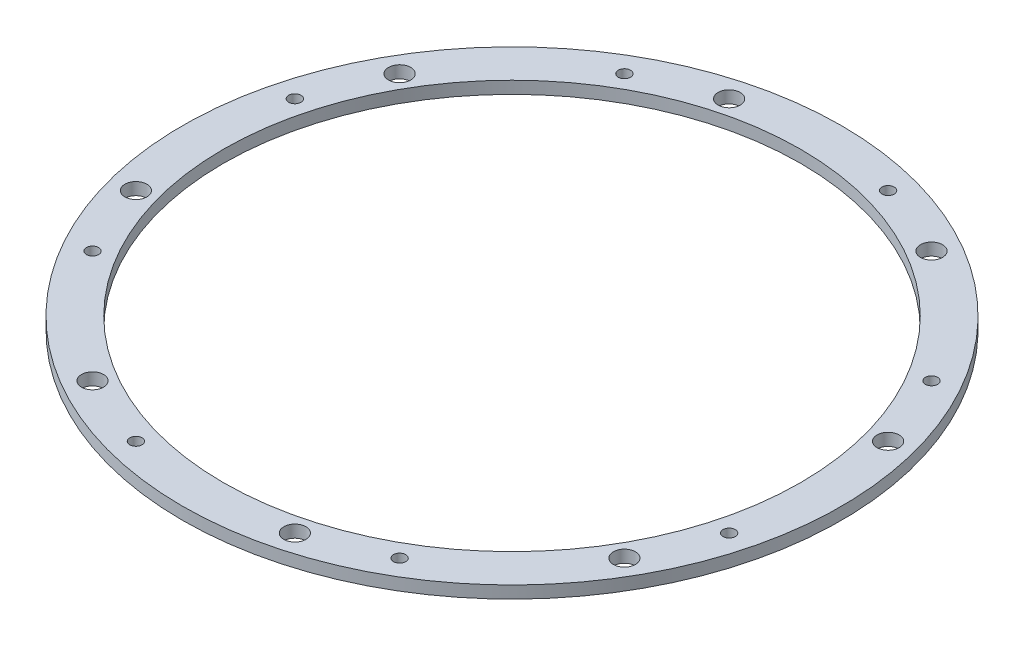
ISO-10303-21;
HEADER;
FILE_DESCRIPTION(('STEP AP214'),'2;1');
FILE_NAME('part.step','',(''),(''),'','','');
FILE_SCHEMA(('AUTOMOTIVE_DESIGN { 1 0 10303 214 1 1 1 1 }'));
ENDSEC;
DATA;
#1=APPLICATION_CONTEXT('core data for automotive mechanical design processes');
#2=APPLICATION_PROTOCOL_DEFINITION('international standard','automotive_design',2000,#1);
#3=PRODUCT_CONTEXT('',#1,'mechanical');
#4=PRODUCT('Part','Part','',(#3));
#5=PRODUCT_RELATED_PRODUCT_CATEGORY('part','',(#4));
#6=PRODUCT_DEFINITION_FORMATION('','',#4);
#7=PRODUCT_DEFINITION_CONTEXT('part definition',#1,'design');
#8=PRODUCT_DEFINITION('design','',#6,#7);
#9=PRODUCT_DEFINITION_SHAPE('','',#8);
#10=(LENGTH_UNIT() NAMED_UNIT(*) SI_UNIT(.MILLI.,.METRE.));
#11=(NAMED_UNIT(*) PLANE_ANGLE_UNIT() SI_UNIT($,.RADIAN.));
#12=(NAMED_UNIT(*) SI_UNIT($,.STERADIAN.) SOLID_ANGLE_UNIT());
#13=UNCERTAINTY_MEASURE_WITH_UNIT(LENGTH_MEASURE(1.E-05),#10,'distance_accuracy_value','');
#14=(GEOMETRIC_REPRESENTATION_CONTEXT(3) GLOBAL_UNCERTAINTY_ASSIGNED_CONTEXT((#13)) GLOBAL_UNIT_ASSIGNED_CONTEXT((#10,
#11,#12)) REPRESENTATION_CONTEXT('',''));
#15=CARTESIAN_POINT('',(0.,0.,0.));
#16=DIRECTION('',(0.,0.,1.));
#17=DIRECTION('',(1.,0.,0.));
#18=AXIS2_PLACEMENT_3D('',#15,#16,#17);
#19=CARTESIAN_POINT('',(0.,4.,0.));
#20=DIRECTION('',(0.,1.,0.));
#21=DIRECTION('',(0.,0.,1.));
#22=AXIS2_PLACEMENT_3D('',#19,#20,#21);
#23=PLANE('',#22);
#24=CARTESIAN_POINT('',(96.7567900193762,4.,-25.9259037479189));
#25=DIRECTION('',(0.,1.,0.));
#26=DIRECTION('',(0.,0.,1.));
#27=AXIS2_PLACEMENT_3D('',#24,#25,#26);
#28=CIRCLE('',#27,3.59999999999997);
#29=CARTESIAN_POINT('',(96.7567900193762,4.,-22.3259037479189));
#30=VERTEX_POINT('',#29);
#31=EDGE_CURVE('E61',#30,#30,#28,.T.);
#32=ORIENTED_EDGE('',*,*,#31,.F.);
#33=EDGE_LOOP('',(#32));
#34=FACE_BOUND('',#33,.T.);
#35=CARTESIAN_POINT('',(86.7497646970869,4.,50.0850000000006));
#36=DIRECTION('',(0.,1.,0.));
#37=DIRECTION('',(0.,0.,1.));
#38=AXIS2_PLACEMENT_3D('',#35,#36,#37);
#39=CIRCLE('',#38,3.59999999999999);
#40=CARTESIAN_POINT('',(86.7497646970869,4.,53.6850000000006));
#41=VERTEX_POINT('',#40);
#42=EDGE_CURVE('E191',#41,#41,#39,.T.);
#43=ORIENTED_EDGE('',*,*,#42,.F.);
#44=EDGE_LOOP('',(#43));
#45=FACE_BOUND('',#44,.T.);
#46=CARTESIAN_POINT('',(25.9259037479189,4.,96.7567900193762));
#47=DIRECTION('',(0.,1.,0.));
#48=DIRECTION('',(0.,0.,1.));
#49=AXIS2_PLACEMENT_3D('',#46,#47,#48);
#50=CIRCLE('',#49,3.6);
#51=CARTESIAN_POINT('',(25.9259037479189,4.,100.356790019376));
#52=VERTEX_POINT('',#51);
#53=EDGE_CURVE('E195',#52,#52,#50,.T.);
#54=ORIENTED_EDGE('',*,*,#53,.F.);
#55=EDGE_LOOP('',(#54));
#56=FACE_BOUND('',#55,.T.);
#57=CARTESIAN_POINT('',(-50.0850000000006,4.,86.7497646970869));
#58=DIRECTION('',(0.,1.,0.));
#59=DIRECTION('',(0.,0.,1.));
#60=AXIS2_PLACEMENT_3D('',#57,#58,#59);
#61=CIRCLE('',#60,3.60000000000001);
#62=CARTESIAN_POINT('',(-50.0850000000006,4.,90.3497646970869));
#63=VERTEX_POINT('',#62);
#64=EDGE_CURVE('E199',#63,#63,#61,.T.);
#65=ORIENTED_EDGE('',*,*,#64,.F.);
#66=EDGE_LOOP('',(#65));
#67=FACE_BOUND('',#66,.T.);
#68=CARTESIAN_POINT('',(-96.7567900193762,4.,25.9259037479189));
#69=DIRECTION('',(0.,1.,0.));
#70=DIRECTION('',(0.,0.,1.));
#71=AXIS2_PLACEMENT_3D('',#68,#69,#70);
#72=CIRCLE('',#71,3.6);
#73=CARTESIAN_POINT('',(-96.7567900193762,4.,29.5259037479189));
#74=VERTEX_POINT('',#73);
#75=EDGE_CURVE('E203',#74,#74,#72,.T.);
#76=ORIENTED_EDGE('',*,*,#75,.F.);
#77=EDGE_LOOP('',(#76));
#78=FACE_BOUND('',#77,.T.);
#79=CARTESIAN_POINT('',(-86.7497646970869,4.,-50.0850000000006));
#80=DIRECTION('',(0.,1.,0.));
#81=DIRECTION('',(0.,0.,1.));
#82=AXIS2_PLACEMENT_3D('',#79,#80,#81);
#83=CIRCLE('',#82,3.60000000000002);
#84=CARTESIAN_POINT('',(-86.7497646970869,4.,-46.4850000000005));
#85=VERTEX_POINT('',#84);
#86=EDGE_CURVE('E207',#85,#85,#83,.T.);
#87=ORIENTED_EDGE('',*,*,#86,.F.);
#88=EDGE_LOOP('',(#87));
#89=FACE_BOUND('',#88,.T.);
#90=CARTESIAN_POINT('',(-25.9259037479189,4.,-96.7567900193762));
#91=DIRECTION('',(0.,1.,0.));
#92=DIRECTION('',(0.,0.,1.));
#93=AXIS2_PLACEMENT_3D('',#90,#91,#92);
#94=CIRCLE('',#93,3.59999999999999);
#95=CARTESIAN_POINT('',(-25.9259037479189,4.,-93.1567900193762));
#96=VERTEX_POINT('',#95);
#97=EDGE_CURVE('E211',#96,#96,#94,.T.);
#98=ORIENTED_EDGE('',*,*,#97,.F.);
#99=EDGE_LOOP('',(#98));
#100=FACE_BOUND('',#99,.T.);
#101=CARTESIAN_POINT('',(50.0850000000006,4.,-86.7497646970869));
#102=DIRECTION('',(0.,1.,0.));
#103=DIRECTION('',(0.,0.,1.));
#104=AXIS2_PLACEMENT_3D('',#101,#102,#103);
#105=CIRCLE('',#104,3.60000000000002);
#106=CARTESIAN_POINT('',(50.0850000000006,4.,-83.1497646970869));
#107=VERTEX_POINT('',#106);
#108=EDGE_CURVE('E215',#107,#107,#105,.T.);
#109=ORIENTED_EDGE('',*,*,#108,.F.);
#110=EDGE_LOOP('',(#109));
#111=FACE_BOUND('',#110,.T.);
#112=CARTESIAN_POINT('',(-50.0849999999995,4.,-86.7497646970875));
#113=DIRECTION('',(0.,1.,0.));
#114=DIRECTION('',(0.,0.,1.));
#115=AXIS2_PLACEMENT_3D('',#112,#113,#114);
#116=CIRCLE('',#115,1.99999999999998);
#117=CARTESIAN_POINT('',(-50.0849999999995,4.,-84.7497646970875));
#118=VERTEX_POINT('',#117);
#119=EDGE_CURVE('E102',#118,#118,#116,.T.);
#120=ORIENTED_EDGE('',*,*,#119,.F.);
#121=EDGE_LOOP('',(#120));
#122=FACE_BOUND('',#121,.T.);
#123=CARTESIAN_POINT('',(-86.7497646970875,4.,50.0849999999995));
#124=DIRECTION('',(0.,1.,0.));
#125=DIRECTION('',(0.,0.,1.));
#126=AXIS2_PLACEMENT_3D('',#123,#124,#125);
#127=CIRCLE('',#126,1.99999999999998);
#128=CARTESIAN_POINT('',(-86.7497646970875,4.,52.0849999999995));
#129=VERTEX_POINT('',#128);
#130=EDGE_CURVE('E118',#129,#129,#127,.T.);
#131=ORIENTED_EDGE('',*,*,#130,.F.);
#132=EDGE_LOOP('',(#131));
#133=FACE_BOUND('',#132,.T.);
#134=CARTESIAN_POINT('',(50.0849999999995,4.,86.7497646970875));
#135=DIRECTION('',(0.,1.,0.));
#136=DIRECTION('',(0.,0.,1.));
#137=AXIS2_PLACEMENT_3D('',#134,#135,#136);
#138=CIRCLE('',#137,2.);
#139=CARTESIAN_POINT('',(50.0849999999995,4.,88.7497646970875));
#140=VERTEX_POINT('',#139);
#141=EDGE_CURVE('E134',#140,#140,#138,.T.);
#142=ORIENTED_EDGE('',*,*,#141,.F.);
#143=EDGE_LOOP('',(#142));
#144=FACE_BOUND('',#143,.T.);
#145=CARTESIAN_POINT('',(86.7497646970875,4.,-50.0849999999995));
#146=DIRECTION('',(0.,1.,0.));
#147=DIRECTION('',(0.,0.,1.));
#148=AXIS2_PLACEMENT_3D('',#145,#146,#147);
#149=CIRCLE('',#148,1.99999999999997);
#150=CARTESIAN_POINT('',(86.7497646970875,4.,-48.0849999999995));
#151=VERTEX_POINT('',#150);
#152=EDGE_CURVE('E150',#151,#151,#149,.T.);
#153=ORIENTED_EDGE('',*,*,#152,.F.);
#154=EDGE_LOOP('',(#153));
#155=FACE_BOUND('',#154,.T.);
#156=CARTESIAN_POINT('',(0.,4.,0.));
#157=DIRECTION('',(0.,1.,0.));
#158=DIRECTION('',(0.,0.,1.));
#159=AXIS2_PLACEMENT_3D('',#156,#157,#158);
#160=CIRCLE('',#159,107.5);
#161=CARTESIAN_POINT('',(0.,4.,107.5));
#162=VERTEX_POINT('',#161);
#163=EDGE_CURVE('E10',#162,#162,#160,.T.);
#164=ORIENTED_EDGE('',*,*,#163,.T.);
#165=EDGE_LOOP('',(#164));
#166=FACE_BOUND('',#165,.T.);
#167=CARTESIAN_POINT('',(0.,4.,0.));
#168=DIRECTION('',(0.,1.,0.));
#169=DIRECTION('',(0.,0.,1.));
#170=AXIS2_PLACEMENT_3D('',#167,#168,#169);
#171=CIRCLE('',#170,94.17);
#172=CARTESIAN_POINT('',(0.,4.,94.17));
#173=VERTEX_POINT('',#172);
#174=EDGE_CURVE('E50',#173,#173,#171,.T.);
#175=ORIENTED_EDGE('',*,*,#174,.F.);
#176=EDGE_LOOP('',(#175));
#177=FACE_BOUND('',#176,.T.);
#178=CARTESIAN_POINT('',(96.7567900193758,4.,25.92590374792));
#179=DIRECTION('',(0.,1.,0.));
#180=DIRECTION('',(0.,0.,1.));
#181=AXIS2_PLACEMENT_3D('',#178,#179,#180);
#182=CIRCLE('',#181,1.99999999999998);
#183=CARTESIAN_POINT('',(96.7567900193758,4.,27.92590374792));
#184=VERTEX_POINT('',#183);
#185=EDGE_CURVE('E142',#184,#184,#182,.T.);
#186=ORIENTED_EDGE('',*,*,#185,.F.);
#187=EDGE_LOOP('',(#186));
#188=FACE_BOUND('',#187,.T.);
#189=CARTESIAN_POINT('',(-25.92590374792,4.,96.7567900193758));
#190=DIRECTION('',(0.,1.,0.));
#191=DIRECTION('',(0.,0.,1.));
#192=AXIS2_PLACEMENT_3D('',#189,#190,#191);
#193=CIRCLE('',#192,2.00000000000001);
#194=CARTESIAN_POINT('',(-25.92590374792,4.,98.7567900193758));
#195=VERTEX_POINT('',#194);
#196=EDGE_CURVE('E126',#195,#195,#193,.T.);
#197=ORIENTED_EDGE('',*,*,#196,.F.);
#198=EDGE_LOOP('',(#197));
#199=FACE_BOUND('',#198,.T.);
#200=CARTESIAN_POINT('',(-96.7567900193758,4.,-25.92590374792));
#201=DIRECTION('',(0.,1.,0.));
#202=DIRECTION('',(0.,0.,1.));
#203=AXIS2_PLACEMENT_3D('',#200,#201,#202);
#204=CIRCLE('',#203,2.);
#205=CARTESIAN_POINT('',(-96.7567900193758,4.,-23.92590374792));
#206=VERTEX_POINT('',#205);
#207=EDGE_CURVE('E110',#206,#206,#204,.T.);
#208=ORIENTED_EDGE('',*,*,#207,.F.);
#209=EDGE_LOOP('',(#208));
#210=FACE_BOUND('',#209,.T.);
#211=CARTESIAN_POINT('',(25.92590374792,4.,-96.7567900193758));
#212=DIRECTION('',(0.,1.,0.));
#213=DIRECTION('',(0.,0.,1.));
#214=AXIS2_PLACEMENT_3D('',#211,#212,#213);
#215=CIRCLE('',#214,2.);
#216=CARTESIAN_POINT('',(25.92590374792,4.,-94.7567900193758));
#217=VERTEX_POINT('',#216);
#218=EDGE_CURVE('E92',#217,#217,#215,.T.);
#219=ORIENTED_EDGE('',*,*,#218,.F.);
#220=EDGE_LOOP('',(#219));
#221=FACE_BOUND('',#220,.T.);
#222=ADVANCED_FACE('F35',(#34,#45,#56,#67,#78,#89,#100,#111,#122,#133,#144,#155,#166,#177,#188,
#199,#210,#221),#23,.T.);
#223=CARTESIAN_POINT('',(0.,0.,0.));
#224=DIRECTION('',(0.,1.,0.));
#225=DIRECTION('',(0.,0.,1.));
#226=AXIS2_PLACEMENT_3D('',#223,#224,#225);
#227=PLANE('',#226);
#228=CARTESIAN_POINT('',(96.7567900193762,0.,-25.9259037479189));
#229=DIRECTION('',(0.,1.,0.));
#230=DIRECTION('',(0.,0.,1.));
#231=AXIS2_PLACEMENT_3D('',#228,#229,#230);
#232=CIRCLE('',#231,3.59999999999997);
#233=CARTESIAN_POINT('',(96.7567900193762,0.,-22.3259037479189));
#234=VERTEX_POINT('',#233);
#235=EDGE_CURVE('E39',#234,#234,#232,.T.);
#236=ORIENTED_EDGE('',*,*,#235,.T.);
#237=EDGE_LOOP('',(#236));
#238=FACE_BOUND('',#237,.T.);
#239=CARTESIAN_POINT('',(86.7497646970869,0.,50.0850000000006));
#240=DIRECTION('',(0.,1.,0.));
#241=DIRECTION('',(0.,0.,1.));
#242=AXIS2_PLACEMENT_3D('',#239,#240,#241);
#243=CIRCLE('',#242,3.59999999999999);
#244=CARTESIAN_POINT('',(86.7497646970869,0.,53.6850000000006));
#245=VERTEX_POINT('',#244);
#246=EDGE_CURVE('E80',#245,#245,#243,.T.);
#247=ORIENTED_EDGE('',*,*,#246,.T.);
#248=EDGE_LOOP('',(#247));
#249=FACE_BOUND('',#248,.T.);
#250=CARTESIAN_POINT('',(25.9259037479189,0.,96.7567900193762));
#251=DIRECTION('',(0.,1.,0.));
#252=DIRECTION('',(0.,0.,1.));
#253=AXIS2_PLACEMENT_3D('',#250,#251,#252);
#254=CIRCLE('',#253,3.6);
#255=CARTESIAN_POINT('',(25.9259037479189,0.,100.356790019376));
#256=VERTEX_POINT('',#255);
#257=EDGE_CURVE('E77',#256,#256,#254,.T.);
#258=ORIENTED_EDGE('',*,*,#257,.T.);
#259=EDGE_LOOP('',(#258));
#260=FACE_BOUND('',#259,.T.);
#261=CARTESIAN_POINT('',(-50.0850000000006,0.,86.7497646970869));
#262=DIRECTION('',(0.,1.,0.));
#263=DIRECTION('',(0.,0.,1.));
#264=AXIS2_PLACEMENT_3D('',#261,#262,#263);
#265=CIRCLE('',#264,3.60000000000001);
#266=CARTESIAN_POINT('',(-50.0850000000006,0.,90.3497646970869));
#267=VERTEX_POINT('',#266);
#268=EDGE_CURVE('E73',#267,#267,#265,.T.);
#269=ORIENTED_EDGE('',*,*,#268,.T.);
#270=EDGE_LOOP('',(#269));
#271=FACE_BOUND('',#270,.T.);
#272=CARTESIAN_POINT('',(-96.7567900193762,0.,25.9259037479189));
#273=DIRECTION('',(0.,1.,0.));
#274=DIRECTION('',(0.,0.,1.));
#275=AXIS2_PLACEMENT_3D('',#272,#273,#274);
#276=CIRCLE('',#275,3.6);
#277=CARTESIAN_POINT('',(-96.7567900193762,0.,29.5259037479189));
#278=VERTEX_POINT('',#277);
#279=EDGE_CURVE('E69',#278,#278,#276,.T.);
#280=ORIENTED_EDGE('',*,*,#279,.T.);
#281=EDGE_LOOP('',(#280));
#282=FACE_BOUND('',#281,.T.);
#283=CARTESIAN_POINT('',(-86.7497646970869,0.,-50.0850000000006));
#284=DIRECTION('',(0.,1.,0.));
#285=DIRECTION('',(0.,0.,1.));
#286=AXIS2_PLACEMENT_3D('',#283,#284,#285);
#287=CIRCLE('',#286,3.60000000000002);
#288=CARTESIAN_POINT('',(-86.7497646970869,0.,-46.4850000000005));
#289=VERTEX_POINT('',#288);
#290=EDGE_CURVE('E65',#289,#289,#287,.T.);
#291=ORIENTED_EDGE('',*,*,#290,.T.);
#292=EDGE_LOOP('',(#291));
#293=FACE_BOUND('',#292,.T.);
#294=CARTESIAN_POINT('',(-25.9259037479189,0.,-96.7567900193762));
#295=DIRECTION('',(0.,1.,0.));
#296=DIRECTION('',(0.,0.,1.));
#297=AXIS2_PLACEMENT_3D('',#294,#295,#296);
#298=CIRCLE('',#297,3.59999999999999);
#299=CARTESIAN_POINT('',(-25.9259037479189,0.,-93.1567900193762));
#300=VERTEX_POINT('',#299);
#301=EDGE_CURVE('E60',#300,#300,#298,.T.);
#302=ORIENTED_EDGE('',*,*,#301,.T.);
#303=EDGE_LOOP('',(#302));
#304=FACE_BOUND('',#303,.T.);
#305=CARTESIAN_POINT('',(50.0850000000006,0.,-86.7497646970869));
#306=DIRECTION('',(0.,1.,0.));
#307=DIRECTION('',(0.,0.,1.));
#308=AXIS2_PLACEMENT_3D('',#305,#306,#307);
#309=CIRCLE('',#308,3.60000000000002);
#310=CARTESIAN_POINT('',(50.0850000000006,0.,-83.1497646970869));
#311=VERTEX_POINT('',#310);
#312=EDGE_CURVE('E56',#311,#311,#309,.T.);
#313=ORIENTED_EDGE('',*,*,#312,.T.);
#314=EDGE_LOOP('',(#313));
#315=FACE_BOUND('',#314,.T.);
#316=CARTESIAN_POINT('',(0.,0.,0.));
#317=DIRECTION('',(0.,1.,0.));
#318=DIRECTION('',(0.,0.,1.));
#319=AXIS2_PLACEMENT_3D('',#316,#317,#318);
#320=CIRCLE('',#319,107.5);
#321=CARTESIAN_POINT('',(0.,0.,107.5));
#322=VERTEX_POINT('',#321);
#323=EDGE_CURVE('E44',#322,#322,#320,.T.);
#324=ORIENTED_EDGE('',*,*,#323,.F.);
#325=EDGE_LOOP('',(#324));
#326=FACE_BOUND('',#325,.T.);
#327=CARTESIAN_POINT('',(0.,0.,0.));
#328=DIRECTION('',(0.,1.,0.));
#329=DIRECTION('',(0.,0.,1.));
#330=AXIS2_PLACEMENT_3D('',#327,#328,#329);
#331=CIRCLE('',#330,94.17);
#332=CARTESIAN_POINT('',(0.,0.,94.17));
#333=VERTEX_POINT('',#332);
#334=EDGE_CURVE('E53',#333,#333,#331,.T.);
#335=ORIENTED_EDGE('',*,*,#334,.T.);
#336=EDGE_LOOP('',(#335));
#337=FACE_BOUND('',#336,.T.);
#338=CARTESIAN_POINT('',(86.7497646970875,0.,-50.0849999999995));
#339=DIRECTION('',(0.,1.,0.));
#340=DIRECTION('',(0.,0.,1.));
#341=AXIS2_PLACEMENT_3D('',#338,#339,#340);
#342=CIRCLE('',#341,1.99999999999997);
#343=CARTESIAN_POINT('',(86.7497646970875,0.,-48.0849999999995));
#344=VERTEX_POINT('',#343);
#345=EDGE_CURVE('E146',#344,#344,#342,.T.);
#346=ORIENTED_EDGE('',*,*,#345,.T.);
#347=EDGE_LOOP('',(#346));
#348=FACE_BOUND('',#347,.T.);
#349=CARTESIAN_POINT('',(96.7567900193758,0.,25.92590374792));
#350=DIRECTION('',(0.,1.,0.));
#351=DIRECTION('',(0.,0.,1.));
#352=AXIS2_PLACEMENT_3D('',#349,#350,#351);
#353=CIRCLE('',#352,1.99999999999998);
#354=CARTESIAN_POINT('',(96.7567900193758,0.,27.92590374792));
#355=VERTEX_POINT('',#354);
#356=EDGE_CURVE('E138',#355,#355,#353,.T.);
#357=ORIENTED_EDGE('',*,*,#356,.T.);
#358=EDGE_LOOP('',(#357));
#359=FACE_BOUND('',#358,.T.);
#360=CARTESIAN_POINT('',(50.0849999999995,0.,86.7497646970875));
#361=DIRECTION('',(0.,1.,0.));
#362=DIRECTION('',(0.,0.,1.));
#363=AXIS2_PLACEMENT_3D('',#360,#361,#362);
#364=CIRCLE('',#363,2.);
#365=CARTESIAN_POINT('',(50.0849999999995,0.,88.7497646970875));
#366=VERTEX_POINT('',#365);
#367=EDGE_CURVE('E130',#366,#366,#364,.T.);
#368=ORIENTED_EDGE('',*,*,#367,.T.);
#369=EDGE_LOOP('',(#368));
#370=FACE_BOUND('',#369,.T.);
#371=CARTESIAN_POINT('',(-25.92590374792,0.,96.7567900193758));
#372=DIRECTION('',(0.,1.,0.));
#373=DIRECTION('',(0.,0.,1.));
#374=AXIS2_PLACEMENT_3D('',#371,#372,#373);
#375=CIRCLE('',#374,2.00000000000001);
#376=CARTESIAN_POINT('',(-25.92590374792,0.,98.7567900193758));
#377=VERTEX_POINT('',#376);
#378=EDGE_CURVE('E122',#377,#377,#375,.T.);
#379=ORIENTED_EDGE('',*,*,#378,.T.);
#380=EDGE_LOOP('',(#379));
#381=FACE_BOUND('',#380,.T.);
#382=CARTESIAN_POINT('',(-86.7497646970875,0.,50.0849999999995));
#383=DIRECTION('',(0.,1.,0.));
#384=DIRECTION('',(0.,0.,1.));
#385=AXIS2_PLACEMENT_3D('',#382,#383,#384);
#386=CIRCLE('',#385,1.99999999999998);
#387=CARTESIAN_POINT('',(-86.7497646970875,0.,52.0849999999995));
#388=VERTEX_POINT('',#387);
#389=EDGE_CURVE('E114',#388,#388,#386,.T.);
#390=ORIENTED_EDGE('',*,*,#389,.T.);
#391=EDGE_LOOP('',(#390));
#392=FACE_BOUND('',#391,.T.);
#393=CARTESIAN_POINT('',(-96.7567900193758,0.,-25.92590374792));
#394=DIRECTION('',(0.,1.,0.));
#395=DIRECTION('',(0.,0.,1.));
#396=AXIS2_PLACEMENT_3D('',#393,#394,#395);
#397=CIRCLE('',#396,2.);
#398=CARTESIAN_POINT('',(-96.7567900193758,0.,-23.92590374792));
#399=VERTEX_POINT('',#398);
#400=EDGE_CURVE('E106',#399,#399,#397,.T.);
#401=ORIENTED_EDGE('',*,*,#400,.T.);
#402=EDGE_LOOP('',(#401));
#403=FACE_BOUND('',#402,.T.);
#404=CARTESIAN_POINT('',(-50.0849999999995,0.,-86.7497646970875));
#405=DIRECTION('',(0.,1.,0.));
#406=DIRECTION('',(0.,0.,1.));
#407=AXIS2_PLACEMENT_3D('',#404,#405,#406);
#408=CIRCLE('',#407,1.99999999999998);
#409=CARTESIAN_POINT('',(-50.0849999999995,0.,-84.7497646970875));
#410=VERTEX_POINT('',#409);
#411=EDGE_CURVE('E98',#410,#410,#408,.T.);
#412=ORIENTED_EDGE('',*,*,#411,.T.);
#413=EDGE_LOOP('',(#412));
#414=FACE_BOUND('',#413,.T.);
#415=CARTESIAN_POINT('',(25.92590374792,0.,-96.7567900193758));
#416=DIRECTION('',(0.,1.,0.));
#417=DIRECTION('',(0.,0.,1.));
#418=AXIS2_PLACEMENT_3D('',#415,#416,#417);
#419=CIRCLE('',#418,2.);
#420=CARTESIAN_POINT('',(25.92590374792,0.,-94.7567900193758));
#421=VERTEX_POINT('',#420);
#422=EDGE_CURVE('E87',#421,#421,#419,.T.);
#423=ORIENTED_EDGE('',*,*,#422,.T.);
#424=EDGE_LOOP('',(#423));
#425=FACE_BOUND('',#424,.T.);
#426=ADVANCED_FACE('F164',(#238,#249,#260,#271,#282,#293,#304,#315,#326,#337,#348,#359,#370,
#381,#392,#403,#414,#425),#227,.F.);
#427=CARTESIAN_POINT('',(0.,4.,0.));
#428=DIRECTION('',(0.,-1.,0.));
#429=DIRECTION('',(0.,0.,-1.));
#430=AXIS2_PLACEMENT_3D('',#427,#428,#429);
#431=CYLINDRICAL_SURFACE('',#430,107.5);
#432=ORIENTED_EDGE('',*,*,#163,.F.);
#433=EDGE_LOOP('',(#432));
#434=FACE_BOUND('',#433,.T.);
#435=ORIENTED_EDGE('',*,*,#323,.T.);
#436=EDGE_LOOP('',(#435));
#437=FACE_BOUND('',#436,.T.);
#438=ADVANCED_FACE('F37',(#434,#437),#431,.T.);
#439=CARTESIAN_POINT('',(0.,4.,0.));
#440=DIRECTION('',(0.,-1.,0.));
#441=DIRECTION('',(0.,0.,-1.));
#442=AXIS2_PLACEMENT_3D('',#439,#440,#441);
#443=CYLINDRICAL_SURFACE('',#442,94.17);
#444=ORIENTED_EDGE('',*,*,#174,.T.);
#445=EDGE_LOOP('',(#444));
#446=FACE_BOUND('',#445,.T.);
#447=ORIENTED_EDGE('',*,*,#334,.F.);
#448=EDGE_LOOP('',(#447));
#449=FACE_BOUND('',#448,.T.);
#450=ADVANCED_FACE('F167',(#446,#449),#443,.F.);
#451=CARTESIAN_POINT('',(86.7497646970875,4.,-50.0849999999995));
#452=DIRECTION('',(0.,-1.,0.));
#453=DIRECTION('',(0.,0.,-1.));
#454=AXIS2_PLACEMENT_3D('',#451,#452,#453);
#455=CYLINDRICAL_SURFACE('',#454,1.99999999999997);
#456=ORIENTED_EDGE('',*,*,#152,.T.);
#457=EDGE_LOOP('',(#456));
#458=FACE_BOUND('',#457,.T.);
#459=ORIENTED_EDGE('',*,*,#345,.F.);
#460=EDGE_LOOP('',(#459));
#461=FACE_BOUND('',#460,.T.);
#462=ADVANCED_FACE('F169',(#458,#461),#455,.F.);
#463=CARTESIAN_POINT('',(96.7567900193758,4.,25.92590374792));
#464=DIRECTION('',(0.,-1.,0.));
#465=DIRECTION('',(0.,0.,-1.));
#466=AXIS2_PLACEMENT_3D('',#463,#464,#465);
#467=CYLINDRICAL_SURFACE('',#466,1.99999999999998);
#468=ORIENTED_EDGE('',*,*,#185,.T.);
#469=EDGE_LOOP('',(#468));
#470=FACE_BOUND('',#469,.T.);
#471=ORIENTED_EDGE('',*,*,#356,.F.);
#472=EDGE_LOOP('',(#471));
#473=FACE_BOUND('',#472,.T.);
#474=ADVANCED_FACE('F175',(#470,#473),#467,.F.);
#475=CARTESIAN_POINT('',(50.0849999999995,4.,86.7497646970875));
#476=DIRECTION('',(0.,-1.,0.));
#477=DIRECTION('',(0.,0.,-1.));
#478=AXIS2_PLACEMENT_3D('',#475,#476,#477);
#479=CYLINDRICAL_SURFACE('',#478,2.);
#480=ORIENTED_EDGE('',*,*,#141,.T.);
#481=EDGE_LOOP('',(#480));
#482=FACE_BOUND('',#481,.T.);
#483=ORIENTED_EDGE('',*,*,#367,.F.);
#484=EDGE_LOOP('',(#483));
#485=FACE_BOUND('',#484,.T.);
#486=ADVANCED_FACE('F261',(#482,#485),#479,.F.);
#487=CARTESIAN_POINT('',(-25.92590374792,4.,96.7567900193758));
#488=DIRECTION('',(0.,-1.,0.));
#489=DIRECTION('',(0.,0.,-1.));
#490=AXIS2_PLACEMENT_3D('',#487,#488,#489);
#491=CYLINDRICAL_SURFACE('',#490,2.00000000000001);
#492=ORIENTED_EDGE('',*,*,#196,.T.);
#493=EDGE_LOOP('',(#492));
#494=FACE_BOUND('',#493,.T.);
#495=ORIENTED_EDGE('',*,*,#378,.F.);
#496=EDGE_LOOP('',(#495));
#497=FACE_BOUND('',#496,.T.);
#498=ADVANCED_FACE('F257',(#494,#497),#491,.F.);
#499=CARTESIAN_POINT('',(-86.7497646970875,4.,50.0849999999995));
#500=DIRECTION('',(0.,-1.,0.));
#501=DIRECTION('',(0.,0.,-1.));
#502=AXIS2_PLACEMENT_3D('',#499,#500,#501);
#503=CYLINDRICAL_SURFACE('',#502,1.99999999999998);
#504=ORIENTED_EDGE('',*,*,#130,.T.);
#505=EDGE_LOOP('',(#504));
#506=FACE_BOUND('',#505,.T.);
#507=ORIENTED_EDGE('',*,*,#389,.F.);
#508=EDGE_LOOP('',(#507));
#509=FACE_BOUND('',#508,.T.);
#510=ADVANCED_FACE('F253',(#506,#509),#503,.F.);
#511=CARTESIAN_POINT('',(-96.7567900193758,4.,-25.92590374792));
#512=DIRECTION('',(0.,-1.,0.));
#513=DIRECTION('',(0.,0.,-1.));
#514=AXIS2_PLACEMENT_3D('',#511,#512,#513);
#515=CYLINDRICAL_SURFACE('',#514,2.);
#516=ORIENTED_EDGE('',*,*,#207,.T.);
#517=EDGE_LOOP('',(#516));
#518=FACE_BOUND('',#517,.T.);
#519=ORIENTED_EDGE('',*,*,#400,.F.);
#520=EDGE_LOOP('',(#519));
#521=FACE_BOUND('',#520,.T.);
#522=ADVANCED_FACE('F246',(#518,#521),#515,.F.);
#523=CARTESIAN_POINT('',(-50.0849999999995,4.,-86.7497646970875));
#524=DIRECTION('',(0.,-1.,0.));
#525=DIRECTION('',(0.,0.,-1.));
#526=AXIS2_PLACEMENT_3D('',#523,#524,#525);
#527=CYLINDRICAL_SURFACE('',#526,1.99999999999998);
#528=ORIENTED_EDGE('',*,*,#119,.T.);
#529=EDGE_LOOP('',(#528));
#530=FACE_BOUND('',#529,.T.);
#531=ORIENTED_EDGE('',*,*,#411,.F.);
#532=EDGE_LOOP('',(#531));
#533=FACE_BOUND('',#532,.T.);
#534=ADVANCED_FACE('F237',(#530,#533),#527,.F.);
#535=CARTESIAN_POINT('',(25.92590374792,4.,-96.7567900193758));
#536=DIRECTION('',(0.,-1.,0.));
#537=DIRECTION('',(0.,0.,-1.));
#538=AXIS2_PLACEMENT_3D('',#535,#536,#537);
#539=CYLINDRICAL_SURFACE('',#538,2.);
#540=ORIENTED_EDGE('',*,*,#218,.T.);
#541=EDGE_LOOP('',(#540));
#542=FACE_BOUND('',#541,.T.);
#543=ORIENTED_EDGE('',*,*,#422,.F.);
#544=EDGE_LOOP('',(#543));
#545=FACE_BOUND('',#544,.T.);
#546=ADVANCED_FACE('F233',(#542,#545),#539,.F.);
#547=CARTESIAN_POINT('',(50.0850000000006,-6.,-86.7497646970869));
#548=DIRECTION('',(0.,1.,0.));
#549=DIRECTION('',(0.,0.,1.));
#550=AXIS2_PLACEMENT_3D('',#547,#548,#549);
#551=CYLINDRICAL_SURFACE('',#550,3.60000000000002);
#552=ORIENTED_EDGE('',*,*,#108,.T.);
#553=EDGE_LOOP('',(#552));
#554=FACE_BOUND('',#553,.T.);
#555=ORIENTED_EDGE('',*,*,#312,.F.);
#556=EDGE_LOOP('',(#555));
#557=FACE_BOUND('',#556,.T.);
#558=ADVANCED_FACE('F236',(#554,#557),#551,.F.);
#559=CARTESIAN_POINT('',(-25.9259037479189,-6.,-96.7567900193762));
#560=DIRECTION('',(0.,1.,0.));
#561=DIRECTION('',(0.,0.,1.));
#562=AXIS2_PLACEMENT_3D('',#559,#560,#561);
#563=CYLINDRICAL_SURFACE('',#562,3.59999999999999);
#564=ORIENTED_EDGE('',*,*,#97,.T.);
#565=EDGE_LOOP('',(#564));
#566=FACE_BOUND('',#565,.T.);
#567=ORIENTED_EDGE('',*,*,#301,.F.);
#568=EDGE_LOOP('',(#567));
#569=FACE_BOUND('',#568,.T.);
#570=ADVANCED_FACE('F243',(#566,#569),#563,.F.);
#571=CARTESIAN_POINT('',(-86.7497646970869,-6.,-50.0850000000006));
#572=DIRECTION('',(0.,1.,0.));
#573=DIRECTION('',(0.,0.,1.));
#574=AXIS2_PLACEMENT_3D('',#571,#572,#573);
#575=CYLINDRICAL_SURFACE('',#574,3.60000000000002);
#576=ORIENTED_EDGE('',*,*,#86,.T.);
#577=EDGE_LOOP('',(#576));
#578=FACE_BOUND('',#577,.T.);
#579=ORIENTED_EDGE('',*,*,#290,.F.);
#580=EDGE_LOOP('',(#579));
#581=FACE_BOUND('',#580,.T.);
#582=ADVANCED_FACE('F340',(#578,#581),#575,.F.);
#583=CARTESIAN_POINT('',(-96.7567900193762,-6.,25.9259037479189));
#584=DIRECTION('',(0.,1.,0.));
#585=DIRECTION('',(0.,0.,1.));
#586=AXIS2_PLACEMENT_3D('',#583,#584,#585);
#587=CYLINDRICAL_SURFACE('',#586,3.6);
#588=ORIENTED_EDGE('',*,*,#75,.T.);
#589=EDGE_LOOP('',(#588));
#590=FACE_BOUND('',#589,.T.);
#591=ORIENTED_EDGE('',*,*,#279,.F.);
#592=EDGE_LOOP('',(#591));
#593=FACE_BOUND('',#592,.T.);
#594=ADVANCED_FACE('F349',(#590,#593),#587,.F.);
#595=CARTESIAN_POINT('',(-50.0850000000006,-6.,86.7497646970869));
#596=DIRECTION('',(0.,1.,0.));
#597=DIRECTION('',(0.,0.,1.));
#598=AXIS2_PLACEMENT_3D('',#595,#596,#597);
#599=CYLINDRICAL_SURFACE('',#598,3.60000000000001);
#600=ORIENTED_EDGE('',*,*,#64,.T.);
#601=EDGE_LOOP('',(#600));
#602=FACE_BOUND('',#601,.T.);
#603=ORIENTED_EDGE('',*,*,#268,.F.);
#604=EDGE_LOOP('',(#603));
#605=FACE_BOUND('',#604,.T.);
#606=ADVANCED_FACE('F359',(#602,#605),#599,.F.);
#607=CARTESIAN_POINT('',(25.9259037479189,-6.,96.7567900193762));
#608=DIRECTION('',(0.,1.,0.));
#609=DIRECTION('',(0.,0.,1.));
#610=AXIS2_PLACEMENT_3D('',#607,#608,#609);
#611=CYLINDRICAL_SURFACE('',#610,3.6);
#612=ORIENTED_EDGE('',*,*,#53,.T.);
#613=EDGE_LOOP('',(#612));
#614=FACE_BOUND('',#613,.T.);
#615=ORIENTED_EDGE('',*,*,#257,.F.);
#616=EDGE_LOOP('',(#615));
#617=FACE_BOUND('',#616,.T.);
#618=ADVANCED_FACE('F369',(#614,#617),#611,.F.);
#619=CARTESIAN_POINT('',(86.7497646970869,-6.,50.0850000000006));
#620=DIRECTION('',(0.,1.,0.));
#621=DIRECTION('',(0.,0.,1.));
#622=AXIS2_PLACEMENT_3D('',#619,#620,#621);
#623=CYLINDRICAL_SURFACE('',#622,3.59999999999999);
#624=ORIENTED_EDGE('',*,*,#42,.T.);
#625=EDGE_LOOP('',(#624));
#626=FACE_BOUND('',#625,.T.);
#627=ORIENTED_EDGE('',*,*,#246,.F.);
#628=EDGE_LOOP('',(#627));
#629=FACE_BOUND('',#628,.T.);
#630=ADVANCED_FACE('F379',(#626,#629),#623,.F.);
#631=CARTESIAN_POINT('',(96.7567900193762,-6.,-25.9259037479189));
#632=DIRECTION('',(0.,1.,0.));
#633=DIRECTION('',(0.,0.,1.));
#634=AXIS2_PLACEMENT_3D('',#631,#632,#633);
#635=CYLINDRICAL_SURFACE('',#634,3.59999999999997);
#636=ORIENTED_EDGE('',*,*,#31,.T.);
#637=EDGE_LOOP('',(#636));
#638=FACE_BOUND('',#637,.T.);
#639=ORIENTED_EDGE('',*,*,#235,.F.);
#640=EDGE_LOOP('',(#639));
#641=FACE_BOUND('',#640,.T.);
#642=ADVANCED_FACE('F389',(#638,#641),#635,.F.);
#643=CLOSED_SHELL('',(#222,#426,#438,#450,#462,#474,#486,#498,#510,#522,#534,#546,#558,#570,
#582,#594,#606,#618,#630,#642));
#644=MANIFOLD_SOLID_BREP('B2',#643);
#645=ADVANCED_BREP_SHAPE_REPRESENTATION('',(#18,#644),#14);
#646=SHAPE_DEFINITION_REPRESENTATION(#9,#645);
ENDSEC;
END-ISO-10303-21;
